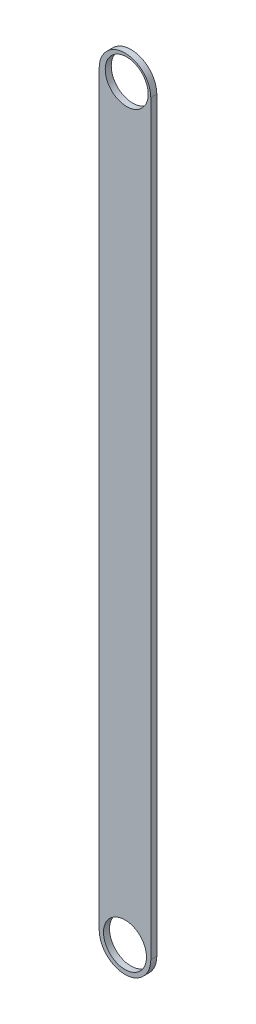
ISO-10303-21;
HEADER;
FILE_DESCRIPTION(('STEP AP214'),'2;1');
FILE_NAME('part.step','',(''),(''),'','','');
FILE_SCHEMA(('AUTOMOTIVE_DESIGN { 1 0 10303 214 1 1 1 1 }'));
ENDSEC;
DATA;
#1=APPLICATION_CONTEXT('core data for automotive mechanical design processes');
#2=APPLICATION_PROTOCOL_DEFINITION('international standard','automotive_design',2000,#1);
#3=PRODUCT_CONTEXT('',#1,'mechanical');
#4=PRODUCT('Part','Part','',(#3));
#5=PRODUCT_RELATED_PRODUCT_CATEGORY('part','',(#4));
#6=PRODUCT_DEFINITION_FORMATION('','',#4);
#7=PRODUCT_DEFINITION_CONTEXT('part definition',#1,'design');
#8=PRODUCT_DEFINITION('design','',#6,#7);
#9=PRODUCT_DEFINITION_SHAPE('','',#8);
#10=(LENGTH_UNIT() NAMED_UNIT(*) SI_UNIT(.MILLI.,.METRE.));
#11=(NAMED_UNIT(*) PLANE_ANGLE_UNIT() SI_UNIT($,.RADIAN.));
#12=(NAMED_UNIT(*) SI_UNIT($,.STERADIAN.) SOLID_ANGLE_UNIT());
#13=UNCERTAINTY_MEASURE_WITH_UNIT(LENGTH_MEASURE(1.E-05),#10,'distance_accuracy_value','');
#14=(GEOMETRIC_REPRESENTATION_CONTEXT(3) GLOBAL_UNCERTAINTY_ASSIGNED_CONTEXT((#13)) GLOBAL_UNIT_ASSIGNED_CONTEXT((#10,
#11,#12)) REPRESENTATION_CONTEXT('',''));
#15=CARTESIAN_POINT('',(0.,0.,0.));
#16=DIRECTION('',(0.,0.,1.));
#17=DIRECTION('',(1.,0.,0.));
#18=AXIS2_PLACEMENT_3D('',#15,#16,#17);
#19=CARTESIAN_POINT('',(128.01,-58.65,-0.045));
#20=DIRECTION('',(0.,0.,-1.));
#21=DIRECTION('',(0.,-1.,0.));
#22=AXIS2_PLACEMENT_3D('',#19,#20,#21);
#23=CYLINDRICAL_SURFACE('',#22,0.125);
#24=CARTESIAN_POINT('',(128.01,-58.65,-0.035));
#25=DIRECTION('',(0.,0.,-1.));
#26=DIRECTION('',(0.,-1.,0.));
#27=AXIS2_PLACEMENT_3D('',#24,#25,#26);
#28=CIRCLE('',#27,0.125);
#29=CARTESIAN_POINT('',(128.01,-58.775,-0.035));
#30=VERTEX_POINT('',#29);
#31=EDGE_CURVE('E100',#30,#30,#28,.T.);
#32=ORIENTED_EDGE('',*,*,#31,.T.);
#33=DIRECTION('',(0.,0.,1.));
#34=VECTOR('',#33,1.);
#35=CARTESIAN_POINT('',(128.01,-58.775,-0.045));
#36=LINE('',#35,#34);
#37=CARTESIAN_POINT('',(128.01,-58.775,0.));
#38=VERTEX_POINT('',#37);
#39=EDGE_CURVE('E11',#30,#38,#36,.T.);
#40=ORIENTED_EDGE('',*,*,#39,.T.);
#41=CARTESIAN_POINT('',(128.01,-58.65,0.));
#42=DIRECTION('',(0.,0.,-1.));
#43=DIRECTION('',(0.,-1.,0.));
#44=AXIS2_PLACEMENT_3D('',#41,#42,#43);
#45=CIRCLE('',#44,0.125);
#46=EDGE_CURVE('E89',#38,#38,#45,.T.);
#47=ORIENTED_EDGE('',*,*,#46,.F.);
#48=ORIENTED_EDGE('',*,*,#39,.F.);
#49=EDGE_LOOP('',(#32,#40,#47,#48));
#50=FACE_BOUND('',#49,.T.);
#51=ADVANCED_FACE('F17',(#50),#23,.F.);
#52=CARTESIAN_POINT('',(128.,-63.,-0.045));
#53=DIRECTION('',(0.,0.,-1.));
#54=DIRECTION('',(0.,-1.,0.));
#55=AXIS2_PLACEMENT_3D('',#52,#53,#54);
#56=CYLINDRICAL_SURFACE('',#55,0.125);
#57=CARTESIAN_POINT('',(128.,-63.,-0.035));
#58=DIRECTION('',(0.,0.,-1.));
#59=DIRECTION('',(0.,-1.,0.));
#60=AXIS2_PLACEMENT_3D('',#57,#58,#59);
#61=CIRCLE('',#60,0.125);
#62=CARTESIAN_POINT('',(128.,-63.125,-0.035));
#63=VERTEX_POINT('',#62);
#64=EDGE_CURVE('E86',#63,#63,#61,.T.);
#65=ORIENTED_EDGE('',*,*,#64,.T.);
#66=DIRECTION('',(0.,0.,1.));
#67=VECTOR('',#66,1.);
#68=CARTESIAN_POINT('',(128.,-63.125,-0.045));
#69=LINE('',#68,#67);
#70=CARTESIAN_POINT('',(128.,-63.125,0.));
#71=VERTEX_POINT('',#70);
#72=EDGE_CURVE('E26',#63,#71,#69,.T.);
#73=ORIENTED_EDGE('',*,*,#72,.T.);
#74=CARTESIAN_POINT('',(128.,-63.,0.));
#75=DIRECTION('',(0.,0.,-1.));
#76=DIRECTION('',(0.,-1.,0.));
#77=AXIS2_PLACEMENT_3D('',#74,#75,#76);
#78=CIRCLE('',#77,0.125);
#79=EDGE_CURVE('E87',#71,#71,#78,.T.);
#80=ORIENTED_EDGE('',*,*,#79,.F.);
#81=ORIENTED_EDGE('',*,*,#72,.F.);
#82=EDGE_LOOP('',(#65,#73,#80,#81));
#83=FACE_BOUND('',#82,.T.);
#84=ADVANCED_FACE('F19',(#83),#56,.F.);
#85=CARTESIAN_POINT('',(128.15,-63.,-0.035));
#86=DIRECTION('',(-1.,0.,0.));
#87=DIRECTION('',(0.,0.,1.));
#88=AXIS2_PLACEMENT_3D('',#85,#86,#87);
#89=PLANE('',#88);
#90=DIRECTION('',(0.,1.,0.));
#91=VECTOR('',#90,1.);
#92=CARTESIAN_POINT('',(128.15,-63.,-0.035));
#93=LINE('',#92,#91);
#94=CARTESIAN_POINT('',(128.15,-63.,-0.035));
#95=VERTEX_POINT('',#94);
#96=CARTESIAN_POINT('',(128.15,-58.66,-0.035));
#97=VERTEX_POINT('',#96);
#98=EDGE_CURVE('E98',#95,#97,#93,.T.);
#99=ORIENTED_EDGE('',*,*,#98,.T.);
#100=DIRECTION('',(0.,0.,1.));
#101=VECTOR('',#100,1.);
#102=CARTESIAN_POINT('',(128.15,-58.66,-0.035));
#103=LINE('',#102,#101);
#104=CARTESIAN_POINT('',(128.15,-58.66,0.));
#105=VERTEX_POINT('',#104);
#106=EDGE_CURVE('E135',#97,#105,#103,.T.);
#107=ORIENTED_EDGE('',*,*,#106,.T.);
#108=DIRECTION('',(0.,1.,0.));
#109=VECTOR('',#108,1.);
#110=CARTESIAN_POINT('',(128.15,-63.,0.));
#111=LINE('',#110,#109);
#112=CARTESIAN_POINT('',(128.15,-63.,0.));
#113=VERTEX_POINT('',#112);
#114=EDGE_CURVE('E102',#113,#105,#111,.T.);
#115=ORIENTED_EDGE('',*,*,#114,.F.);
#116=DIRECTION('',(0.,0.,1.));
#117=VECTOR('',#116,1.);
#118=CARTESIAN_POINT('',(128.15,-63.,-0.035));
#119=LINE('',#118,#117);
#120=EDGE_CURVE('E118',#95,#113,#119,.T.);
#121=ORIENTED_EDGE('',*,*,#120,.F.);
#122=EDGE_LOOP('',(#99,#107,#115,#121));
#123=FACE_BOUND('',#122,.T.);
#124=ADVANCED_FACE('F134',(#123),#89,.F.);
#125=CARTESIAN_POINT('',(127.85,-58.66,0.));
#126=DIRECTION('',(0.,0.,1.));
#127=DIRECTION('',(1.,0.,0.));
#128=AXIS2_PLACEMENT_3D('',#125,#126,#127);
#129=PLANE('',#128);
#130=ORIENTED_EDGE('',*,*,#46,.T.);
#131=EDGE_LOOP('',(#130));
#132=FACE_BOUND('',#131,.T.);
#133=ORIENTED_EDGE('',*,*,#79,.T.);
#134=EDGE_LOOP('',(#133));
#135=FACE_BOUND('',#134,.T.);
#136=DIRECTION('',(0.,-1.,0.));
#137=VECTOR('',#136,1.);
#138=CARTESIAN_POINT('',(127.85,-58.66,0.));
#139=LINE('',#138,#137);
#140=CARTESIAN_POINT('',(127.85,-58.66,0.));
#141=VERTEX_POINT('',#140);
#142=CARTESIAN_POINT('',(127.85,-63.,0.));
#143=VERTEX_POINT('',#142);
#144=EDGE_CURVE('E159',#141,#143,#139,.T.);
#145=ORIENTED_EDGE('',*,*,#144,.T.);
#146=CARTESIAN_POINT('',(128.,-63.,0.));
#147=DIRECTION('',(0.,0.,1.));
#148=DIRECTION('',(-1.,0.,0.));
#149=AXIS2_PLACEMENT_3D('',#146,#147,#148);
#150=CIRCLE('',#149,0.15);
#151=EDGE_CURVE('E122',#143,#113,#150,.T.);
#152=ORIENTED_EDGE('',*,*,#151,.T.);
#153=ORIENTED_EDGE('',*,*,#114,.T.);
#154=CARTESIAN_POINT('',(128.,-58.66,0.));
#155=DIRECTION('',(0.,0.,1.));
#156=DIRECTION('',(1.,0.,0.));
#157=AXIS2_PLACEMENT_3D('',#154,#155,#156);
#158=CIRCLE('',#157,0.15);
#159=EDGE_CURVE('E145',#105,#141,#158,.T.);
#160=ORIENTED_EDGE('',*,*,#159,.T.);
#161=EDGE_LOOP('',(#145,#152,#153,#160));
#162=FACE_BOUND('',#161,.T.);
#163=ADVANCED_FACE('F171',(#132,#135,#162),#129,.T.);
#164=CARTESIAN_POINT('',(127.85,-58.66,-0.035));
#165=DIRECTION('',(0.,0.,1.));
#166=DIRECTION('',(1.,0.,0.));
#167=AXIS2_PLACEMENT_3D('',#164,#165,#166);
#168=PLANE('',#167);
#169=ORIENTED_EDGE('',*,*,#31,.F.);
#170=EDGE_LOOP('',(#169));
#171=FACE_BOUND('',#170,.T.);
#172=ORIENTED_EDGE('',*,*,#64,.F.);
#173=EDGE_LOOP('',(#172));
#174=FACE_BOUND('',#173,.T.);
#175=CARTESIAN_POINT('',(128.,-58.66,-0.035));
#176=DIRECTION('',(0.,0.,1.));
#177=DIRECTION('',(1.,0.,0.));
#178=AXIS2_PLACEMENT_3D('',#175,#176,#177);
#179=CIRCLE('',#178,0.15);
#180=CARTESIAN_POINT('',(127.85,-58.66,-0.035));
#181=VERTEX_POINT('',#180);
#182=EDGE_CURVE('E143',#97,#181,#179,.T.);
#183=ORIENTED_EDGE('',*,*,#182,.F.);
#184=ORIENTED_EDGE('',*,*,#98,.F.);
#185=CARTESIAN_POINT('',(128.,-63.,-0.035));
#186=DIRECTION('',(0.,0.,1.));
#187=DIRECTION('',(-1.,0.,0.));
#188=AXIS2_PLACEMENT_3D('',#185,#186,#187);
#189=CIRCLE('',#188,0.15);
#190=CARTESIAN_POINT('',(127.85,-63.,-0.035));
#191=VERTEX_POINT('',#190);
#192=EDGE_CURVE('E116',#191,#95,#189,.T.);
#193=ORIENTED_EDGE('',*,*,#192,.F.);
#194=DIRECTION('',(0.,-1.,0.));
#195=VECTOR('',#194,1.);
#196=CARTESIAN_POINT('',(127.85,-58.66,-0.035));
#197=LINE('',#196,#195);
#198=EDGE_CURVE('E151',#181,#191,#197,.T.);
#199=ORIENTED_EDGE('',*,*,#198,.F.);
#200=EDGE_LOOP('',(#183,#184,#193,#199));
#201=FACE_BOUND('',#200,.T.);
#202=ADVANCED_FACE('F149',(#171,#174,#201),#168,.F.);
#203=CARTESIAN_POINT('',(128.,-63.,-0.035));
#204=DIRECTION('',(0.,0.,-1.));
#205=DIRECTION('',(-1.,0.,0.));
#206=AXIS2_PLACEMENT_3D('',#203,#204,#205);
#207=CYLINDRICAL_SURFACE('',#206,0.15);
#208=ORIENTED_EDGE('',*,*,#192,.T.);
#209=ORIENTED_EDGE('',*,*,#120,.T.);
#210=ORIENTED_EDGE('',*,*,#151,.F.);
#211=DIRECTION('',(0.,0.,1.));
#212=VECTOR('',#211,1.);
#213=CARTESIAN_POINT('',(127.85,-63.,-0.035));
#214=LINE('',#213,#212);
#215=EDGE_CURVE('E163',#191,#143,#214,.T.);
#216=ORIENTED_EDGE('',*,*,#215,.F.);
#217=EDGE_LOOP('',(#208,#209,#210,#216));
#218=FACE_BOUND('',#217,.T.);
#219=ADVANCED_FACE('F176',(#218),#207,.T.);
#220=CARTESIAN_POINT('',(128.,-58.66,-0.035));
#221=DIRECTION('',(0.,0.,-1.));
#222=DIRECTION('',(1.,0.,0.));
#223=AXIS2_PLACEMENT_3D('',#220,#221,#222);
#224=CYLINDRICAL_SURFACE('',#223,0.15);
#225=ORIENTED_EDGE('',*,*,#182,.T.);
#226=DIRECTION('',(0.,0.,1.));
#227=VECTOR('',#226,1.);
#228=CARTESIAN_POINT('',(127.85,-58.66,-0.035));
#229=LINE('',#228,#227);
#230=EDGE_CURVE('E153',#181,#141,#229,.T.);
#231=ORIENTED_EDGE('',*,*,#230,.T.);
#232=ORIENTED_EDGE('',*,*,#159,.F.);
#233=ORIENTED_EDGE('',*,*,#106,.F.);
#234=EDGE_LOOP('',(#225,#231,#232,#233));
#235=FACE_BOUND('',#234,.T.);
#236=ADVANCED_FACE('F141',(#235),#224,.T.);
#237=CARTESIAN_POINT('',(127.85,-58.66,-0.035));
#238=DIRECTION('',(1.,0.,0.));
#239=DIRECTION('',(0.,1.,0.));
#240=AXIS2_PLACEMENT_3D('',#237,#238,#239);
#241=PLANE('',#240);
#242=ORIENTED_EDGE('',*,*,#198,.T.);
#243=ORIENTED_EDGE('',*,*,#215,.T.);
#244=ORIENTED_EDGE('',*,*,#144,.F.);
#245=ORIENTED_EDGE('',*,*,#230,.F.);
#246=EDGE_LOOP('',(#242,#243,#244,#245));
#247=FACE_BOUND('',#246,.T.);
#248=ADVANCED_FACE('F174',(#247),#241,.F.);
#249=CLOSED_SHELL('',(#51,#84,#124,#163,#202,#219,#236,#248));
#250=MANIFOLD_SOLID_BREP('B1',#249);
#251=ADVANCED_BREP_SHAPE_REPRESENTATION('',(#18,#250),#14);
#252=SHAPE_DEFINITION_REPRESENTATION(#9,#251);
ENDSEC;
END-ISO-10303-21;
